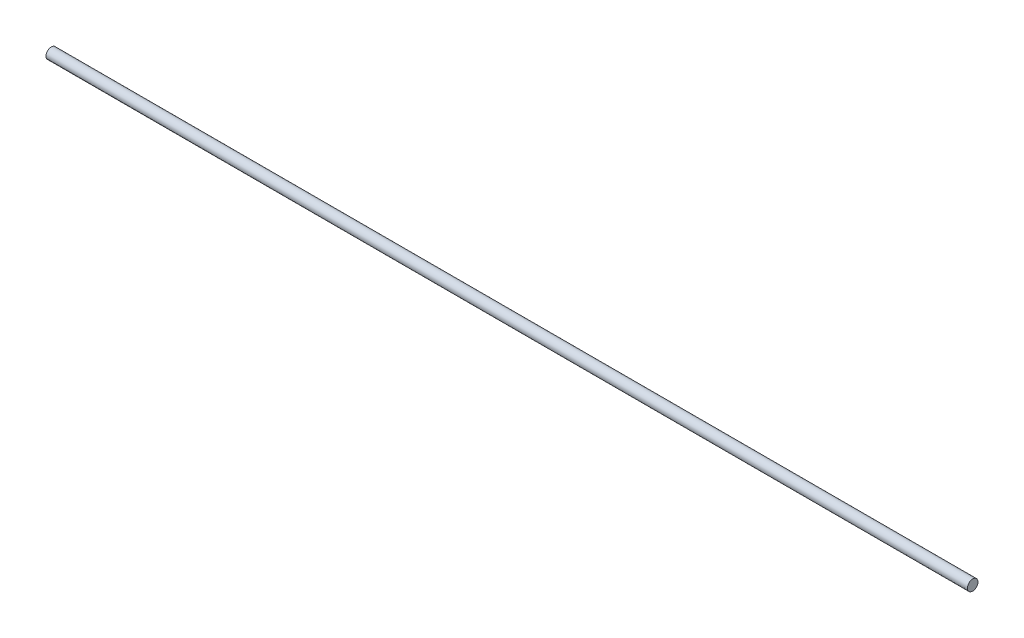
ISO-10303-21;
HEADER;
FILE_DESCRIPTION(('STEP AP214'),'2;1');
FILE_NAME('part.step','',(''),(''),'','','');
FILE_SCHEMA(('AUTOMOTIVE_DESIGN { 1 0 10303 214 1 1 1 1 }'));
ENDSEC;
DATA;
#1=APPLICATION_CONTEXT('core data for automotive mechanical design processes');
#2=APPLICATION_PROTOCOL_DEFINITION('international standard','automotive_design',2000,#1);
#3=PRODUCT_CONTEXT('',#1,'mechanical');
#4=PRODUCT('Part','Part','',(#3));
#5=PRODUCT_RELATED_PRODUCT_CATEGORY('part','',(#4));
#6=PRODUCT_DEFINITION_FORMATION('','',#4);
#7=PRODUCT_DEFINITION_CONTEXT('part definition',#1,'design');
#8=PRODUCT_DEFINITION('design','',#6,#7);
#9=PRODUCT_DEFINITION_SHAPE('','',#8);
#10=(LENGTH_UNIT() NAMED_UNIT(*) SI_UNIT(.MILLI.,.METRE.));
#11=(NAMED_UNIT(*) PLANE_ANGLE_UNIT() SI_UNIT($,.RADIAN.));
#12=(NAMED_UNIT(*) SI_UNIT($,.STERADIAN.) SOLID_ANGLE_UNIT());
#13=UNCERTAINTY_MEASURE_WITH_UNIT(LENGTH_MEASURE(1.E-05),#10,'distance_accuracy_value','');
#14=(GEOMETRIC_REPRESENTATION_CONTEXT(3) GLOBAL_UNCERTAINTY_ASSIGNED_CONTEXT((#13)) GLOBAL_UNIT_ASSIGNED_CONTEXT((#10,
#11,#12)) REPRESENTATION_CONTEXT('',''));
#15=CARTESIAN_POINT('',(0.,0.,0.));
#16=DIRECTION('',(0.,0.,1.));
#17=DIRECTION('',(1.,0.,0.));
#18=AXIS2_PLACEMENT_3D('',#15,#16,#17);
#19=CARTESIAN_POINT('',(553.212,0.,0.));
#20=DIRECTION('',(-1.,0.,0.));
#21=DIRECTION('',(0.,0.,1.));
#22=AXIS2_PLACEMENT_3D('',#19,#20,#21);
#23=CYLINDRICAL_SURFACE('',#22,6.35);
#24=CARTESIAN_POINT('',(553.212,0.,0.));
#25=DIRECTION('',(1.,0.,0.));
#26=DIRECTION('',(0.,0.,-1.));
#27=AXIS2_PLACEMENT_3D('',#24,#25,#26);
#28=CIRCLE('',#27,6.35);
#29=CARTESIAN_POINT('',(553.212,0.,-6.35));
#30=VERTEX_POINT('',#29);
#31=EDGE_CURVE('E10',#30,#30,#28,.T.);
#32=ORIENTED_EDGE('',*,*,#31,.F.);
#33=EDGE_LOOP('',(#32));
#34=FACE_BOUND('',#33,.T.);
#35=CARTESIAN_POINT('',(-553.212,0.,0.));
#36=DIRECTION('',(1.,0.,0.));
#37=DIRECTION('',(0.,0.,-1.));
#38=AXIS2_PLACEMENT_3D('',#35,#36,#37);
#39=CIRCLE('',#38,6.35);
#40=CARTESIAN_POINT('',(-553.212,0.,-6.35));
#41=VERTEX_POINT('',#40);
#42=EDGE_CURVE('E46',#41,#41,#39,.T.);
#43=ORIENTED_EDGE('',*,*,#42,.T.);
#44=EDGE_LOOP('',(#43));
#45=FACE_BOUND('',#44,.T.);
#46=ADVANCED_FACE('F43',(#34,#45),#23,.T.);
#47=CARTESIAN_POINT('',(553.212,0.,0.));
#48=DIRECTION('',(1.,0.,0.));
#49=DIRECTION('',(0.,0.,-1.));
#50=AXIS2_PLACEMENT_3D('',#47,#48,#49);
#51=PLANE('',#50);
#52=ORIENTED_EDGE('',*,*,#31,.T.);
#53=EDGE_LOOP('',(#52));
#54=FACE_BOUND('',#53,.T.);
#55=ADVANCED_FACE('F59',(#54),#51,.T.);
#56=CARTESIAN_POINT('',(-553.212,0.,0.));
#57=DIRECTION('',(1.,0.,0.));
#58=DIRECTION('',(0.,0.,-1.));
#59=AXIS2_PLACEMENT_3D('',#56,#57,#58);
#60=PLANE('',#59);
#61=ORIENTED_EDGE('',*,*,#42,.F.);
#62=EDGE_LOOP('',(#61));
#63=FACE_BOUND('',#62,.T.);
#64=ADVANCED_FACE('F57',(#63),#60,.F.);
#65=CLOSED_SHELL('',(#46,#55,#64));
#66=MANIFOLD_SOLID_BREP('B2',#65);
#67=ADVANCED_BREP_SHAPE_REPRESENTATION('',(#18,#66),#14);
#68=SHAPE_DEFINITION_REPRESENTATION(#9,#67);
ENDSEC;
END-ISO-10303-21;
